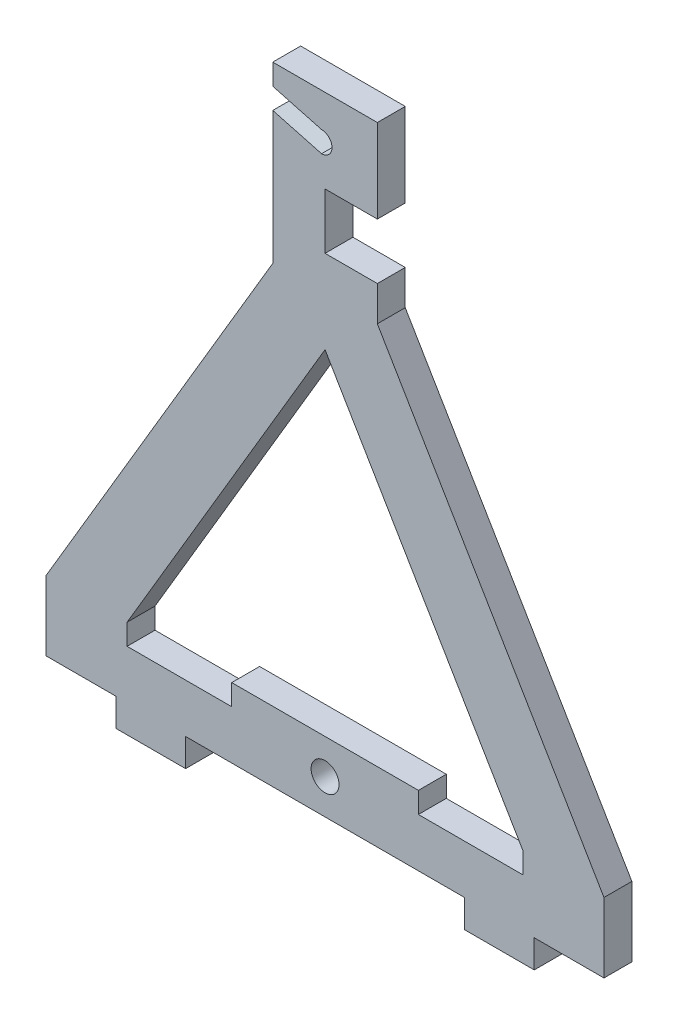
ISO-10303-21;
HEADER;
FILE_DESCRIPTION(('STEP AP214'),'2;1');
FILE_NAME('part.step','',(''),(''),'','','');
FILE_SCHEMA(('AUTOMOTIVE_DESIGN { 1 0 10303 214 1 1 1 1 }'));
ENDSEC;
DATA;
#1=APPLICATION_CONTEXT('core data for automotive mechanical design processes');
#2=APPLICATION_PROTOCOL_DEFINITION('international standard','automotive_design',2000,#1);
#3=PRODUCT_CONTEXT('',#1,'mechanical');
#4=PRODUCT('Part','Part','',(#3));
#5=PRODUCT_RELATED_PRODUCT_CATEGORY('part','',(#4));
#6=PRODUCT_DEFINITION_FORMATION('','',#4);
#7=PRODUCT_DEFINITION_CONTEXT('part definition',#1,'design');
#8=PRODUCT_DEFINITION('design','',#6,#7);
#9=PRODUCT_DEFINITION_SHAPE('','',#8);
#10=(LENGTH_UNIT() NAMED_UNIT(*) SI_UNIT(.MILLI.,.METRE.));
#11=(NAMED_UNIT(*) PLANE_ANGLE_UNIT() SI_UNIT($,.RADIAN.));
#12=(NAMED_UNIT(*) SI_UNIT($,.STERADIAN.) SOLID_ANGLE_UNIT());
#13=UNCERTAINTY_MEASURE_WITH_UNIT(LENGTH_MEASURE(1.E-05),#10,'distance_accuracy_value','');
#14=(GEOMETRIC_REPRESENTATION_CONTEXT(3) GLOBAL_UNCERTAINTY_ASSIGNED_CONTEXT((#13)) GLOBAL_UNIT_ASSIGNED_CONTEXT((#10,
#11,#12)) REPRESENTATION_CONTEXT('',''));
#15=CARTESIAN_POINT('',(0.,0.,0.));
#16=DIRECTION('',(0.,0.,1.));
#17=DIRECTION('',(1.,0.,0.));
#18=AXIS2_PLACEMENT_3D('',#15,#16,#17);
#19=CARTESIAN_POINT('',(-15.,180.,8.));
#20=DIRECTION('',(1.,0.,0.));
#21=DIRECTION('',(0.,1.,0.));
#22=AXIS2_PLACEMENT_3D('',#19,#20,#21);
#23=PLANE('',#22);
#24=DIRECTION('',(0.,-1.,0.));
#25=VECTOR('',#24,1.);
#26=CARTESIAN_POINT('',(-15.,180.,0.));
#27=LINE('',#26,#25);
#28=CARTESIAN_POINT('',(-15.,180.,0.));
#29=VERTEX_POINT('',#28);
#30=CARTESIAN_POINT('',(-15.,174.,0.));
#31=VERTEX_POINT('',#30);
#32=EDGE_CURVE('E470',#29,#31,#27,.T.);
#33=ORIENTED_EDGE('',*,*,#32,.T.);
#34=DIRECTION('',(0.,0.,1.));
#35=VECTOR('',#34,1.);
#36=CARTESIAN_POINT('',(-15.,174.,0.));
#37=LINE('',#36,#35);
#38=CARTESIAN_POINT('',(-15.,174.,8.));
#39=VERTEX_POINT('',#38);
#40=EDGE_CURVE('E279',#31,#39,#37,.T.);
#41=ORIENTED_EDGE('',*,*,#40,.T.);
#42=DIRECTION('',(0.,-1.,0.));
#43=VECTOR('',#42,1.);
#44=CARTESIAN_POINT('',(-15.,180.,8.));
#45=LINE('',#44,#43);
#46=CARTESIAN_POINT('',(-15.,180.,8.));
#47=VERTEX_POINT('',#46);
#48=EDGE_CURVE('E447',#47,#39,#45,.T.);
#49=ORIENTED_EDGE('',*,*,#48,.F.);
#50=DIRECTION('',(0.,0.,-1.));
#51=VECTOR('',#50,1.);
#52=CARTESIAN_POINT('',(-15.,180.,8.));
#53=LINE('',#52,#51);
#54=EDGE_CURVE('E491',#47,#29,#53,.T.);
#55=ORIENTED_EDGE('',*,*,#54,.T.);
#56=EDGE_LOOP('',(#33,#41,#49,#55));
#57=FACE_BOUND('',#56,.T.);
#58=ADVANCED_FACE('F33',(#57),#23,.F.);
#59=CARTESIAN_POINT('',(0.,0.,8.));
#60=DIRECTION('',(0.,0.,1.));
#61=DIRECTION('',(1.,0.,0.));
#62=AXIS2_PLACEMENT_3D('',#59,#60,#61);
#63=PLANE('',#62);
#64=DIRECTION('',(-0.965925826289067,0.258819045102526,0.));
#65=VECTOR('',#64,1.);
#66=CARTESIAN_POINT('',(-15.,174.,8.));
#67=LINE('',#66,#65);
#68=CARTESIAN_POINT('',(-1.,170.248711305964,8.));
#69=VERTEX_POINT('',#68);
#70=EDGE_CURVE('E271',#69,#39,#67,.T.);
#71=ORIENTED_EDGE('',*,*,#70,.F.);
#72=CARTESIAN_POINT('',(-1.,167.248711305964,8.));
#73=DIRECTION('',(0.,0.,1.));
#74=DIRECTION('',(1.,0.,0.));
#75=AXIS2_PLACEMENT_3D('',#72,#73,#74);
#76=CIRCLE('',#75,2.99999999999999);
#77=CARTESIAN_POINT('',(-1.,164.248711305964,8.));
#78=VERTEX_POINT('',#77);
#79=EDGE_CURVE('E273',#78,#69,#76,.T.);
#80=ORIENTED_EDGE('',*,*,#79,.F.);
#81=DIRECTION('',(0.965925826289067,-0.258819045102524,0.));
#82=VECTOR('',#81,1.);
#83=CARTESIAN_POINT('',(-1.,164.248711305964,8.));
#84=LINE('',#83,#82);
#85=CARTESIAN_POINT('',(-15.,168.,8.));
#86=VERTEX_POINT('',#85);
#87=EDGE_CURVE('E251',#86,#78,#84,.T.);
#88=ORIENTED_EDGE('',*,*,#87,.F.);
#89=CARTESIAN_POINT('',(-15.,130.,8.));
#90=VERTEX_POINT('',#89);
#91=EDGE_CURVE('E446',#86,#90,#45,.T.);
#92=ORIENTED_EDGE('',*,*,#91,.T.);
#93=DIRECTION('',(-0.508729312126641,-0.860926528214315,0.));
#94=VECTOR('',#93,1.);
#95=CARTESIAN_POINT('',(-15.,130.,8.));
#96=LINE('',#95,#94);
#97=CARTESIAN_POINT('',(-80.,20.,8.));
#98=VERTEX_POINT('',#97);
#99=EDGE_CURVE('E450',#90,#98,#96,.T.);
#100=ORIENTED_EDGE('',*,*,#99,.T.);
#101=DIRECTION('',(0.,-1.,0.));
#102=VECTOR('',#101,1.);
#103=CARTESIAN_POINT('',(-80.,20.,8.));
#104=LINE('',#103,#102);
#105=CARTESIAN_POINT('',(-80.,0.,8.));
#106=VERTEX_POINT('',#105);
#107=EDGE_CURVE('E452',#98,#106,#104,.T.);
#108=ORIENTED_EDGE('',*,*,#107,.T.);
#109=DIRECTION('',(1.,0.,0.));
#110=VECTOR('',#109,1.);
#111=CARTESIAN_POINT('',(-80.,0.,8.));
#112=LINE('',#111,#110);
#113=CARTESIAN_POINT('',(-60.,0.,8.));
#114=VERTEX_POINT('',#113);
#115=EDGE_CURVE('E455',#106,#114,#112,.T.);
#116=ORIENTED_EDGE('',*,*,#115,.T.);
#117=DIRECTION('',(0.,1.,0.));
#118=VECTOR('',#117,1.);
#119=CARTESIAN_POINT('',(-60.,-8.,8.));
#120=LINE('',#119,#118);
#121=CARTESIAN_POINT('',(-60.,-8.,8.));
#122=VERTEX_POINT('',#121);
#123=EDGE_CURVE('E386',#122,#114,#120,.T.);
#124=ORIENTED_EDGE('',*,*,#123,.F.);
#125=DIRECTION('',(-1.,0.,0.));
#126=VECTOR('',#125,1.);
#127=CARTESIAN_POINT('',(-60.,-8.,8.));
#128=LINE('',#127,#126);
#129=CARTESIAN_POINT('',(-40.,-8.,8.));
#130=VERTEX_POINT('',#129);
#131=EDGE_CURVE('E384',#130,#122,#128,.T.);
#132=ORIENTED_EDGE('',*,*,#131,.F.);
#133=DIRECTION('',(0.,1.,0.));
#134=VECTOR('',#133,1.);
#135=CARTESIAN_POINT('',(-40.,-8.,8.));
#136=LINE('',#135,#134);
#137=CARTESIAN_POINT('',(-40.,0.,8.));
#138=VERTEX_POINT('',#137);
#139=EDGE_CURVE('E393',#130,#138,#136,.T.);
#140=ORIENTED_EDGE('',*,*,#139,.T.);
#141=CARTESIAN_POINT('',(40.,0.,8.));
#142=VERTEX_POINT('',#141);
#143=EDGE_CURVE('E459',#138,#142,#112,.T.);
#144=ORIENTED_EDGE('',*,*,#143,.T.);
#145=DIRECTION('',(0.,1.,0.));
#146=VECTOR('',#145,1.);
#147=CARTESIAN_POINT('',(40.,-8.,8.));
#148=LINE('',#147,#146);
#149=CARTESIAN_POINT('',(40.,-8.,8.));
#150=VERTEX_POINT('',#149);
#151=EDGE_CURVE('E369',#150,#142,#148,.T.);
#152=ORIENTED_EDGE('',*,*,#151,.F.);
#153=DIRECTION('',(1.,0.,0.));
#154=VECTOR('',#153,1.);
#155=CARTESIAN_POINT('',(60.,-8.,8.));
#156=LINE('',#155,#154);
#157=CARTESIAN_POINT('',(60.,-8.,8.));
#158=VERTEX_POINT('',#157);
#159=EDGE_CURVE('E350',#150,#158,#156,.T.);
#160=ORIENTED_EDGE('',*,*,#159,.T.);
#161=DIRECTION('',(0.,1.,0.));
#162=VECTOR('',#161,1.);
#163=CARTESIAN_POINT('',(60.,-8.,8.));
#164=LINE('',#163,#162);
#165=CARTESIAN_POINT('',(60.,0.,8.));
#166=VERTEX_POINT('',#165);
#167=EDGE_CURVE('E372',#158,#166,#164,.T.);
#168=ORIENTED_EDGE('',*,*,#167,.T.);
#169=CARTESIAN_POINT('',(80.,0.,8.));
#170=VERTEX_POINT('',#169);
#171=EDGE_CURVE('E454',#166,#170,#112,.T.);
#172=ORIENTED_EDGE('',*,*,#171,.T.);
#173=DIRECTION('',(0.,1.,0.));
#174=VECTOR('',#173,1.);
#175=CARTESIAN_POINT('',(80.,0.,8.));
#176=LINE('',#175,#174);
#177=CARTESIAN_POINT('',(80.,20.,8.));
#178=VERTEX_POINT('',#177);
#179=EDGE_CURVE('E434',#170,#178,#176,.T.);
#180=ORIENTED_EDGE('',*,*,#179,.T.);
#181=DIRECTION('',(-0.508729312126641,0.860926528214315,0.));
#182=VECTOR('',#181,1.);
#183=CARTESIAN_POINT('',(80.,20.,8.));
#184=LINE('',#183,#182);
#185=CARTESIAN_POINT('',(15.,130.,8.));
#186=VERTEX_POINT('',#185);
#187=EDGE_CURVE('E437',#178,#186,#184,.T.);
#188=ORIENTED_EDGE('',*,*,#187,.T.);
#189=DIRECTION('',(0.,1.,0.));
#190=VECTOR('',#189,1.);
#191=CARTESIAN_POINT('',(15.,180.,8.));
#192=LINE('',#191,#190);
#193=CARTESIAN_POINT('',(15.,140.,8.));
#194=VERTEX_POINT('',#193);
#195=EDGE_CURVE('E441',#186,#194,#192,.T.);
#196=ORIENTED_EDGE('',*,*,#195,.T.);
#197=DIRECTION('',(1.,0.,0.));
#198=VECTOR('',#197,1.);
#199=CARTESIAN_POINT('',(15.,140.,8.));
#200=LINE('',#199,#198);
#201=CARTESIAN_POINT('',(0.,140.,8.));
#202=VERTEX_POINT('',#201);
#203=EDGE_CURVE('E336',#202,#194,#200,.T.);
#204=ORIENTED_EDGE('',*,*,#203,.F.);
#205=DIRECTION('',(0.,-1.,0.));
#206=VECTOR('',#205,1.);
#207=CARTESIAN_POINT('',(0.,156.,8.));
#208=LINE('',#207,#206);
#209=CARTESIAN_POINT('',(0.,156.,8.));
#210=VERTEX_POINT('',#209);
#211=EDGE_CURVE('E333',#210,#202,#208,.T.);
#212=ORIENTED_EDGE('',*,*,#211,.F.);
#213=DIRECTION('',(-1.,0.,0.));
#214=VECTOR('',#213,1.);
#215=CARTESIAN_POINT('',(15.,156.,8.));
#216=LINE('',#215,#214);
#217=CARTESIAN_POINT('',(15.,156.,8.));
#218=VERTEX_POINT('',#217);
#219=EDGE_CURVE('E327',#218,#210,#216,.T.);
#220=ORIENTED_EDGE('',*,*,#219,.F.);
#221=CARTESIAN_POINT('',(15.,180.,8.));
#222=VERTEX_POINT('',#221);
#223=EDGE_CURVE('E440',#218,#222,#192,.T.);
#224=ORIENTED_EDGE('',*,*,#223,.T.);
#225=DIRECTION('',(-1.,0.,0.));
#226=VECTOR('',#225,1.);
#227=CARTESIAN_POINT('',(15.,180.,8.));
#228=LINE('',#227,#226);
#229=EDGE_CURVE('E444',#222,#47,#228,.T.);
#230=ORIENTED_EDGE('',*,*,#229,.T.);
#231=ORIENTED_EDGE('',*,*,#48,.T.);
#232=EDGE_LOOP('',(#71,#80,#88,#92,#100,#108,#116,#124,#132,#140,#144,#152,#160,#168,#172,#180,
#188,#196,#204,#212,#220,#224,#230,#231));
#233=FACE_BOUND('',#232,.T.);
#234=CARTESIAN_POINT('',(0.,9.99999999999999,8.));
#235=DIRECTION('',(0.,0.,1.));
#236=DIRECTION('',(1.,0.,0.));
#237=AXIS2_PLACEMENT_3D('',#234,#235,#236);
#238=CIRCLE('',#237,4.);
#239=CARTESIAN_POINT('',(4.,9.99999999999999,8.));
#240=VERTEX_POINT('',#239);
#241=EDGE_CURVE('E403',#240,#240,#238,.T.);
#242=ORIENTED_EDGE('',*,*,#241,.F.);
#243=EDGE_LOOP('',(#242));
#244=FACE_BOUND('',#243,.T.);
#245=DIRECTION('',(-0.508729312126641,0.860926528214315,0.));
#246=VECTOR('',#245,1.);
#247=CARTESIAN_POINT('',(0.,116.070977417906,8.));
#248=LINE('',#247,#246);
#249=CARTESIAN_POINT('',(56.7692139287625,20.,8.));
#250=VERTEX_POINT('',#249);
#251=CARTESIAN_POINT('',(0.,116.070977417906,8.));
#252=VERTEX_POINT('',#251);
#253=EDGE_CURVE('E412',#250,#252,#248,.T.);
#254=ORIENTED_EDGE('',*,*,#253,.F.);
#255=DIRECTION('',(0.,-1.,0.));
#256=VECTOR('',#255,1.);
#257=CARTESIAN_POINT('',(56.7692139287625,20.,8.));
#258=LINE('',#257,#256);
#259=CARTESIAN_POINT('',(56.7692139287625,14.,8.));
#260=VERTEX_POINT('',#259);
#261=EDGE_CURVE('E282',#250,#260,#258,.T.);
#262=ORIENTED_EDGE('',*,*,#261,.T.);
#263=DIRECTION('',(-1.,0.,0.));
#264=VECTOR('',#263,1.);
#265=CARTESIAN_POINT('',(56.7692139287625,14.,8.));
#266=LINE('',#265,#264);
#267=CARTESIAN_POINT('',(26.7692139287625,14.,8.));
#268=VERTEX_POINT('',#267);
#269=EDGE_CURVE('E288',#260,#268,#266,.T.);
#270=ORIENTED_EDGE('',*,*,#269,.T.);
#271=DIRECTION('',(0.,1.,0.));
#272=VECTOR('',#271,1.);
#273=CARTESIAN_POINT('',(26.7692139287625,20.,8.));
#274=LINE('',#273,#272);
#275=CARTESIAN_POINT('',(26.7692139287625,20.,8.));
#276=VERTEX_POINT('',#275);
#277=EDGE_CURVE('E295',#268,#276,#274,.T.);
#278=ORIENTED_EDGE('',*,*,#277,.T.);
#279=DIRECTION('',(1.,0.,0.));
#280=VECTOR('',#279,1.);
#281=CARTESIAN_POINT('',(56.7692139287625,20.,8.));
#282=LINE('',#281,#280);
#283=CARTESIAN_POINT('',(-26.7692139287625,20.,8.));
#284=VERTEX_POINT('',#283);
#285=EDGE_CURVE('E409',#284,#276,#282,.T.);
#286=ORIENTED_EDGE('',*,*,#285,.F.);
#287=DIRECTION('',(0.,1.,0.));
#288=VECTOR('',#287,1.);
#289=CARTESIAN_POINT('',(-26.7692139287625,20.,8.));
#290=LINE('',#289,#288);
#291=CARTESIAN_POINT('',(-26.7692139287625,14.,8.));
#292=VERTEX_POINT('',#291);
#293=EDGE_CURVE('E311',#292,#284,#290,.T.);
#294=ORIENTED_EDGE('',*,*,#293,.F.);
#295=DIRECTION('',(1.,0.,0.));
#296=VECTOR('',#295,1.);
#297=CARTESIAN_POINT('',(-56.7692139287625,14.,8.));
#298=LINE('',#297,#296);
#299=CARTESIAN_POINT('',(-56.7692139287625,14.,8.));
#300=VERTEX_POINT('',#299);
#301=EDGE_CURVE('E320',#300,#292,#298,.T.);
#302=ORIENTED_EDGE('',*,*,#301,.F.);
#303=DIRECTION('',(0.,-1.,0.));
#304=VECTOR('',#303,1.);
#305=CARTESIAN_POINT('',(-56.7692139287625,20.,8.));
#306=LINE('',#305,#304);
#307=CARTESIAN_POINT('',(-56.7692139287625,20.,8.));
#308=VERTEX_POINT('',#307);
#309=EDGE_CURVE('E303',#308,#300,#306,.T.);
#310=ORIENTED_EDGE('',*,*,#309,.F.);
#311=DIRECTION('',(-0.508729312126641,-0.860926528214315,0.));
#312=VECTOR('',#311,1.);
#313=CARTESIAN_POINT('',(-56.7692139287625,20.,8.));
#314=LINE('',#313,#312);
#315=EDGE_CURVE('E416',#252,#308,#314,.T.);
#316=ORIENTED_EDGE('',*,*,#315,.F.);
#317=EDGE_LOOP('',(#254,#262,#270,#278,#286,#294,#302,#310,#316));
#318=FACE_BOUND('',#317,.T.);
#319=ADVANCED_FACE('F513',(#233,#244,#318),#63,.T.);
#320=CARTESIAN_POINT('',(0.,0.,0.));
#321=DIRECTION('',(0.,0.,1.));
#322=DIRECTION('',(1.,0.,0.));
#323=AXIS2_PLACEMENT_3D('',#320,#321,#322);
#324=PLANE('',#323);
#325=CARTESIAN_POINT('',(0.,9.99999999999999,0.));
#326=DIRECTION('',(0.,0.,1.));
#327=DIRECTION('',(1.,0.,0.));
#328=AXIS2_PLACEMENT_3D('',#325,#326,#327);
#329=CIRCLE('',#328,4.);
#330=CARTESIAN_POINT('',(4.,9.99999999999999,0.));
#331=VERTEX_POINT('',#330);
#332=EDGE_CURVE('E402',#331,#331,#329,.T.);
#333=ORIENTED_EDGE('',*,*,#332,.T.);
#334=EDGE_LOOP('',(#333));
#335=FACE_BOUND('',#334,.T.);
#336=CARTESIAN_POINT('',(-1.,167.248711305964,0.));
#337=DIRECTION('',(0.,0.,1.));
#338=DIRECTION('',(1.,0.,0.));
#339=AXIS2_PLACEMENT_3D('',#336,#337,#338);
#340=CIRCLE('',#339,2.99999999999999);
#341=CARTESIAN_POINT('',(-1.,164.248711305964,0.));
#342=VERTEX_POINT('',#341);
#343=CARTESIAN_POINT('',(-1.,170.248711305964,0.));
#344=VERTEX_POINT('',#343);
#345=EDGE_CURVE('E259',#342,#344,#340,.T.);
#346=ORIENTED_EDGE('',*,*,#345,.T.);
#347=DIRECTION('',(-0.965925826289067,0.258819045102526,0.));
#348=VECTOR('',#347,1.);
#349=CARTESIAN_POINT('',(-15.,174.,0.));
#350=LINE('',#349,#348);
#351=EDGE_CURVE('E264',#344,#31,#350,.T.);
#352=ORIENTED_EDGE('',*,*,#351,.T.);
#353=ORIENTED_EDGE('',*,*,#32,.F.);
#354=DIRECTION('',(-1.,0.,0.));
#355=VECTOR('',#354,1.);
#356=CARTESIAN_POINT('',(15.,180.,0.));
#357=LINE('',#356,#355);
#358=CARTESIAN_POINT('',(15.,180.,0.));
#359=VERTEX_POINT('',#358);
#360=EDGE_CURVE('E468',#359,#29,#357,.T.);
#361=ORIENTED_EDGE('',*,*,#360,.F.);
#362=DIRECTION('',(0.,1.,0.));
#363=VECTOR('',#362,1.);
#364=CARTESIAN_POINT('',(15.,180.,0.));
#365=LINE('',#364,#363);
#366=CARTESIAN_POINT('',(15.,156.,0.));
#367=VERTEX_POINT('',#366);
#368=EDGE_CURVE('E464',#367,#359,#365,.T.);
#369=ORIENTED_EDGE('',*,*,#368,.F.);
#370=DIRECTION('',(-1.,0.,0.));
#371=VECTOR('',#370,1.);
#372=CARTESIAN_POINT('',(0.,156.,0.));
#373=LINE('',#372,#371);
#374=CARTESIAN_POINT('',(0.,156.,0.));
#375=VERTEX_POINT('',#374);
#376=EDGE_CURVE('E56',#367,#375,#373,.T.);
#377=ORIENTED_EDGE('',*,*,#376,.T.);
#378=DIRECTION('',(0.,-1.,0.));
#379=VECTOR('',#378,1.);
#380=CARTESIAN_POINT('',(0.,0.,0.));
#381=LINE('',#380,#379);
#382=CARTESIAN_POINT('',(0.,140.,0.));
#383=VERTEX_POINT('',#382);
#384=EDGE_CURVE('E11',#375,#383,#381,.T.);
#385=ORIENTED_EDGE('',*,*,#384,.T.);
#386=DIRECTION('',(1.,0.,0.));
#387=VECTOR('',#386,1.);
#388=CARTESIAN_POINT('',(0.,140.,0.));
#389=LINE('',#388,#387);
#390=CARTESIAN_POINT('',(15.,140.,0.));
#391=VERTEX_POINT('',#390);
#392=EDGE_CURVE('E343',#383,#391,#389,.T.);
#393=ORIENTED_EDGE('',*,*,#392,.T.);
#394=CARTESIAN_POINT('',(15.,130.,0.));
#395=VERTEX_POINT('',#394);
#396=EDGE_CURVE('E465',#395,#391,#365,.T.);
#397=ORIENTED_EDGE('',*,*,#396,.F.);
#398=DIRECTION('',(-0.508729312126641,0.860926528214315,0.));
#399=VECTOR('',#398,1.);
#400=CARTESIAN_POINT('',(80.,20.,0.));
#401=LINE('',#400,#399);
#402=CARTESIAN_POINT('',(80.,20.,0.));
#403=VERTEX_POINT('',#402);
#404=EDGE_CURVE('E462',#403,#395,#401,.T.);
#405=ORIENTED_EDGE('',*,*,#404,.F.);
#406=DIRECTION('',(0.,1.,0.));
#407=VECTOR('',#406,1.);
#408=CARTESIAN_POINT('',(80.,0.,0.));
#409=LINE('',#408,#407);
#410=CARTESIAN_POINT('',(80.,0.,0.));
#411=VERTEX_POINT('',#410);
#412=EDGE_CURVE('E433',#411,#403,#409,.T.);
#413=ORIENTED_EDGE('',*,*,#412,.F.);
#414=DIRECTION('',(1.,0.,0.));
#415=VECTOR('',#414,1.);
#416=CARTESIAN_POINT('',(-80.,0.,0.));
#417=LINE('',#416,#415);
#418=CARTESIAN_POINT('',(60.,0.,0.));
#419=VERTEX_POINT('',#418);
#420=EDGE_CURVE('E477',#419,#411,#417,.T.);
#421=ORIENTED_EDGE('',*,*,#420,.F.);
#422=DIRECTION('',(0.,1.,0.));
#423=VECTOR('',#422,1.);
#424=CARTESIAN_POINT('',(60.,-8.,0.));
#425=LINE('',#424,#423);
#426=CARTESIAN_POINT('',(60.,-8.,0.));
#427=VERTEX_POINT('',#426);
#428=EDGE_CURVE('E360',#427,#419,#425,.T.);
#429=ORIENTED_EDGE('',*,*,#428,.F.);
#430=DIRECTION('',(-1.,0.,0.));
#431=VECTOR('',#430,1.);
#432=CARTESIAN_POINT('',(60.,-8.,0.));
#433=LINE('',#432,#431);
#434=CARTESIAN_POINT('',(40.,-8.,0.));
#435=VERTEX_POINT('',#434);
#436=EDGE_CURVE('E357',#427,#435,#433,.T.);
#437=ORIENTED_EDGE('',*,*,#436,.T.);
#438=DIRECTION('',(0.,1.,0.));
#439=VECTOR('',#438,1.);
#440=CARTESIAN_POINT('',(40.,-8.,0.));
#441=LINE('',#440,#439);
#442=CARTESIAN_POINT('',(40.,0.,0.));
#443=VERTEX_POINT('',#442);
#444=EDGE_CURVE('E366',#435,#443,#441,.T.);
#445=ORIENTED_EDGE('',*,*,#444,.T.);
#446=CARTESIAN_POINT('',(-40.,0.,0.));
#447=VERTEX_POINT('',#446);
#448=EDGE_CURVE('E479',#447,#443,#417,.T.);
#449=ORIENTED_EDGE('',*,*,#448,.F.);
#450=DIRECTION('',(0.,1.,0.));
#451=VECTOR('',#450,1.);
#452=CARTESIAN_POINT('',(-40.,-8.,0.));
#453=LINE('',#452,#451);
#454=CARTESIAN_POINT('',(-40.,-8.,0.));
#455=VERTEX_POINT('',#454);
#456=EDGE_CURVE('E396',#455,#447,#453,.T.);
#457=ORIENTED_EDGE('',*,*,#456,.F.);
#458=DIRECTION('',(1.,0.,0.));
#459=VECTOR('',#458,1.);
#460=CARTESIAN_POINT('',(-60.,-8.,0.));
#461=LINE('',#460,#459);
#462=CARTESIAN_POINT('',(-60.,-8.,0.));
#463=VERTEX_POINT('',#462);
#464=EDGE_CURVE('E379',#463,#455,#461,.T.);
#465=ORIENTED_EDGE('',*,*,#464,.F.);
#466=DIRECTION('',(0.,1.,0.));
#467=VECTOR('',#466,1.);
#468=CARTESIAN_POINT('',(-60.,-8.,0.));
#469=LINE('',#468,#467);
#470=CARTESIAN_POINT('',(-60.,0.,0.));
#471=VERTEX_POINT('',#470);
#472=EDGE_CURVE('E399',#463,#471,#469,.T.);
#473=ORIENTED_EDGE('',*,*,#472,.T.);
#474=CARTESIAN_POINT('',(-80.,0.,0.));
#475=VERTEX_POINT('',#474);
#476=EDGE_CURVE('E438',#475,#471,#417,.T.);
#477=ORIENTED_EDGE('',*,*,#476,.F.);
#478=DIRECTION('',(0.,-1.,0.));
#479=VECTOR('',#478,1.);
#480=CARTESIAN_POINT('',(-80.,20.,0.));
#481=LINE('',#480,#479);
#482=CARTESIAN_POINT('',(-80.,20.,0.));
#483=VERTEX_POINT('',#482);
#484=EDGE_CURVE('E475',#483,#475,#481,.T.);
#485=ORIENTED_EDGE('',*,*,#484,.F.);
#486=DIRECTION('',(-0.508729312126641,-0.860926528214315,0.));
#487=VECTOR('',#486,1.);
#488=CARTESIAN_POINT('',(-15.,130.,0.));
#489=LINE('',#488,#487);
#490=CARTESIAN_POINT('',(-15.,130.,0.));
#491=VERTEX_POINT('',#490);
#492=EDGE_CURVE('E473',#491,#483,#489,.T.);
#493=ORIENTED_EDGE('',*,*,#492,.F.);
#494=CARTESIAN_POINT('',(-15.,168.,0.));
#495=VERTEX_POINT('',#494);
#496=EDGE_CURVE('E270',#495,#491,#27,.T.);
#497=ORIENTED_EDGE('',*,*,#496,.F.);
#498=DIRECTION('',(0.965925826289067,-0.258819045102524,0.));
#499=VECTOR('',#498,1.);
#500=CARTESIAN_POINT('',(-1.,164.248711305964,0.));
#501=LINE('',#500,#499);
#502=EDGE_CURVE('E48',#495,#342,#501,.T.);
#503=ORIENTED_EDGE('',*,*,#502,.T.);
#504=EDGE_LOOP('',(#346,#352,#353,#361,#369,#377,#385,#393,#397,#405,#413,#421,#429,#437,#445,
#449,#457,#465,#473,#477,#485,#493,#497,#503));
#505=FACE_BOUND('',#504,.T.);
#506=DIRECTION('',(0.,-1.,0.));
#507=VECTOR('',#506,1.);
#508=CARTESIAN_POINT('',(56.7692139287625,20.,0.));
#509=LINE('',#508,#507);
#510=CARTESIAN_POINT('',(56.7692139287625,20.,0.));
#511=VERTEX_POINT('',#510);
#512=CARTESIAN_POINT('',(56.7692139287625,14.,0.));
#513=VERTEX_POINT('',#512);
#514=EDGE_CURVE('E285',#511,#513,#509,.T.);
#515=ORIENTED_EDGE('',*,*,#514,.F.);
#516=DIRECTION('',(-0.508729312126641,0.860926528214315,0.));
#517=VECTOR('',#516,1.);
#518=CARTESIAN_POINT('',(0.,116.070977417906,0.));
#519=LINE('',#518,#517);
#520=CARTESIAN_POINT('',(0.,116.070977417906,0.));
#521=VERTEX_POINT('',#520);
#522=EDGE_CURVE('E422',#511,#521,#519,.T.);
#523=ORIENTED_EDGE('',*,*,#522,.T.);
#524=DIRECTION('',(-0.508729312126641,-0.860926528214315,0.));
#525=VECTOR('',#524,1.);
#526=CARTESIAN_POINT('',(-56.7692139287625,20.,0.));
#527=LINE('',#526,#525);
#528=CARTESIAN_POINT('',(-56.7692139287625,20.,0.));
#529=VERTEX_POINT('',#528);
#530=EDGE_CURVE('E413',#521,#529,#527,.T.);
#531=ORIENTED_EDGE('',*,*,#530,.T.);
#532=DIRECTION('',(0.,-1.,0.));
#533=VECTOR('',#532,1.);
#534=CARTESIAN_POINT('',(-56.7692139287625,20.,0.));
#535=LINE('',#534,#533);
#536=CARTESIAN_POINT('',(-56.7692139287625,14.,0.));
#537=VERTEX_POINT('',#536);
#538=EDGE_CURVE('E307',#529,#537,#535,.T.);
#539=ORIENTED_EDGE('',*,*,#538,.T.);
#540=DIRECTION('',(1.,0.,0.));
#541=VECTOR('',#540,1.);
#542=CARTESIAN_POINT('',(-56.7692139287625,14.,0.));
#543=LINE('',#542,#541);
#544=CARTESIAN_POINT('',(-26.7692139287625,14.,0.));
#545=VERTEX_POINT('',#544);
#546=EDGE_CURVE('E310',#537,#545,#543,.T.);
#547=ORIENTED_EDGE('',*,*,#546,.T.);
#548=DIRECTION('',(0.,1.,0.));
#549=VECTOR('',#548,1.);
#550=CARTESIAN_POINT('',(-26.7692139287625,20.,0.));
#551=LINE('',#550,#549);
#552=CARTESIAN_POINT('',(-26.7692139287625,20.,0.));
#553=VERTEX_POINT('',#552);
#554=EDGE_CURVE('E314',#545,#553,#551,.T.);
#555=ORIENTED_EDGE('',*,*,#554,.T.);
#556=DIRECTION('',(1.,0.,0.));
#557=VECTOR('',#556,1.);
#558=CARTESIAN_POINT('',(56.7692139287625,20.,0.));
#559=LINE('',#558,#557);
#560=CARTESIAN_POINT('',(26.7692139287625,20.,0.));
#561=VERTEX_POINT('',#560);
#562=EDGE_CURVE('E406',#553,#561,#559,.T.);
#563=ORIENTED_EDGE('',*,*,#562,.T.);
#564=DIRECTION('',(0.,1.,0.));
#565=VECTOR('',#564,1.);
#566=CARTESIAN_POINT('',(26.7692139287625,20.,0.));
#567=LINE('',#566,#565);
#568=CARTESIAN_POINT('',(26.7692139287625,14.,0.));
#569=VERTEX_POINT('',#568);
#570=EDGE_CURVE('E287',#569,#561,#567,.T.);
#571=ORIENTED_EDGE('',*,*,#570,.F.);
#572=DIRECTION('',(-1.,0.,0.));
#573=VECTOR('',#572,1.);
#574=CARTESIAN_POINT('',(56.7692139287625,14.,0.));
#575=LINE('',#574,#573);
#576=EDGE_CURVE('E290',#513,#569,#575,.T.);
#577=ORIENTED_EDGE('',*,*,#576,.F.);
#578=EDGE_LOOP('',(#515,#523,#531,#539,#547,#555,#563,#571,#577));
#579=FACE_BOUND('',#578,.T.);
#580=ADVANCED_FACE('F267',(#335,#505,#579),#324,.F.);
#581=CARTESIAN_POINT('',(56.7692139287625,20.,8.));
#582=DIRECTION('',(0.,1.,0.));
#583=DIRECTION('',(0.,0.,1.));
#584=AXIS2_PLACEMENT_3D('',#581,#582,#583);
#585=PLANE('',#584);
#586=ORIENTED_EDGE('',*,*,#285,.T.);
#587=DIRECTION('',(0.,0.,1.));
#588=VECTOR('',#587,1.);
#589=CARTESIAN_POINT('',(26.7692139287625,20.,0.));
#590=LINE('',#589,#588);
#591=EDGE_CURVE('E292',#561,#276,#590,.T.);
#592=ORIENTED_EDGE('',*,*,#591,.F.);
#593=ORIENTED_EDGE('',*,*,#562,.F.);
#594=DIRECTION('',(0.,0.,1.));
#595=VECTOR('',#594,1.);
#596=CARTESIAN_POINT('',(-26.7692139287625,20.,0.));
#597=LINE('',#596,#595);
#598=EDGE_CURVE('E324',#553,#284,#597,.T.);
#599=ORIENTED_EDGE('',*,*,#598,.T.);
#600=EDGE_LOOP('',(#586,#592,#593,#599));
#601=FACE_BOUND('',#600,.T.);
#602=ADVANCED_FACE('F608',(#601),#585,.T.);
#603=CARTESIAN_POINT('',(15.,180.,8.));
#604=DIRECTION('',(-1.,0.,0.));
#605=DIRECTION('',(0.,-1.,0.));
#606=AXIS2_PLACEMENT_3D('',#603,#604,#605);
#607=PLANE('',#606);
#608=ORIENTED_EDGE('',*,*,#396,.T.);
#609=DIRECTION('',(0.,0.,1.));
#610=VECTOR('',#609,1.);
#611=CARTESIAN_POINT('',(15.,140.,8.));
#612=LINE('',#611,#610);
#613=EDGE_CURVE('E41',#391,#194,#612,.T.);
#614=ORIENTED_EDGE('',*,*,#613,.T.);
#615=ORIENTED_EDGE('',*,*,#195,.F.);
#616=DIRECTION('',(0.,0.,-1.));
#617=VECTOR('',#616,1.);
#618=CARTESIAN_POINT('',(15.,130.,8.));
#619=LINE('',#618,#617);
#620=EDGE_CURVE('E497',#186,#395,#619,.T.);
#621=ORIENTED_EDGE('',*,*,#620,.T.);
#622=EDGE_LOOP('',(#608,#614,#615,#621));
#623=FACE_BOUND('',#622,.T.);
#624=ADVANCED_FACE('F507',(#623),#607,.F.);
#625=CARTESIAN_POINT('',(-80.,0.,8.));
#626=DIRECTION('',(0.,1.,0.));
#627=DIRECTION('',(0.,0.,1.));
#628=AXIS2_PLACEMENT_3D('',#625,#626,#627);
#629=PLANE('',#628);
#630=ORIENTED_EDGE('',*,*,#171,.F.);
#631=DIRECTION('',(0.,0.,-1.));
#632=VECTOR('',#631,1.);
#633=CARTESIAN_POINT('',(60.,0.,8.));
#634=LINE('',#633,#632);
#635=EDGE_CURVE('E346',#166,#419,#634,.T.);
#636=ORIENTED_EDGE('',*,*,#635,.T.);
#637=ORIENTED_EDGE('',*,*,#420,.T.);
#638=DIRECTION('',(0.,0.,-1.));
#639=VECTOR('',#638,1.);
#640=CARTESIAN_POINT('',(80.,0.,8.));
#641=LINE('',#640,#639);
#642=EDGE_CURVE('E458',#170,#411,#641,.T.);
#643=ORIENTED_EDGE('',*,*,#642,.F.);
#644=EDGE_LOOP('',(#630,#636,#637,#643));
#645=FACE_BOUND('',#644,.T.);
#646=ADVANCED_FACE('F579',(#645),#629,.F.);
#647=DIRECTION('',(0.,0.,-1.));
#648=VECTOR('',#647,1.);
#649=CARTESIAN_POINT('',(-60.,0.,8.));
#650=LINE('',#649,#648);
#651=EDGE_CURVE('E375',#114,#471,#650,.T.);
#652=ORIENTED_EDGE('',*,*,#651,.F.);
#653=ORIENTED_EDGE('',*,*,#115,.F.);
#654=DIRECTION('',(0.,0.,-1.));
#655=VECTOR('',#654,1.);
#656=CARTESIAN_POINT('',(-80.,0.,8.));
#657=LINE('',#656,#655);
#658=EDGE_CURVE('E482',#106,#475,#657,.T.);
#659=ORIENTED_EDGE('',*,*,#658,.T.);
#660=ORIENTED_EDGE('',*,*,#476,.T.);
#661=EDGE_LOOP('',(#652,#653,#659,#660));
#662=FACE_BOUND('',#661,.T.);
#663=ADVANCED_FACE('F559',(#662),#629,.F.);
#664=ORIENTED_EDGE('',*,*,#448,.T.);
#665=DIRECTION('',(0.,0.,1.));
#666=VECTOR('',#665,1.);
#667=CARTESIAN_POINT('',(40.,0.,8.));
#668=LINE('',#667,#666);
#669=EDGE_CURVE('E351',#443,#142,#668,.T.);
#670=ORIENTED_EDGE('',*,*,#669,.T.);
#671=ORIENTED_EDGE('',*,*,#143,.F.);
#672=DIRECTION('',(0.,0.,1.));
#673=VECTOR('',#672,1.);
#674=CARTESIAN_POINT('',(-40.,0.,8.));
#675=LINE('',#674,#673);
#676=EDGE_CURVE('E380',#447,#138,#675,.T.);
#677=ORIENTED_EDGE('',*,*,#676,.F.);
#678=EDGE_LOOP('',(#664,#670,#671,#677));
#679=FACE_BOUND('',#678,.T.);
#680=ADVANCED_FACE('F575',(#679),#629,.F.);
#681=CARTESIAN_POINT('',(80.,0.,8.));
#682=DIRECTION('',(-1.,0.,0.));
#683=DIRECTION('',(0.,0.,1.));
#684=AXIS2_PLACEMENT_3D('',#681,#682,#683);
#685=PLANE('',#684);
#686=ORIENTED_EDGE('',*,*,#412,.T.);
#687=DIRECTION('',(0.,0.,-1.));
#688=VECTOR('',#687,1.);
#689=CARTESIAN_POINT('',(80.,20.,8.));
#690=LINE('',#689,#688);
#691=EDGE_CURVE('E500',#178,#403,#690,.T.);
#692=ORIENTED_EDGE('',*,*,#691,.F.);
#693=ORIENTED_EDGE('',*,*,#179,.F.);
#694=ORIENTED_EDGE('',*,*,#642,.T.);
#695=EDGE_LOOP('',(#686,#692,#693,#694));
#696=FACE_BOUND('',#695,.T.);
#697=ADVANCED_FACE('F35',(#696),#685,.F.);
#698=CARTESIAN_POINT('',(80.,20.,8.));
#699=DIRECTION('',(-0.860926528214315,-0.508729312126641,0.));
#700=DIRECTION('',(0.508729312126641,-0.860926528214315,0.));
#701=AXIS2_PLACEMENT_3D('',#698,#699,#700);
#702=PLANE('',#701);
#703=ORIENTED_EDGE('',*,*,#404,.T.);
#704=ORIENTED_EDGE('',*,*,#620,.F.);
#705=ORIENTED_EDGE('',*,*,#187,.F.);
#706=ORIENTED_EDGE('',*,*,#691,.T.);
#707=EDGE_LOOP('',(#703,#704,#705,#706));
#708=FACE_BOUND('',#707,.T.);
#709=ADVANCED_FACE('F520',(#708),#702,.F.);
#710=ORIENTED_EDGE('',*,*,#223,.F.);
#711=DIRECTION('',(0.,0.,-1.));
#712=VECTOR('',#711,1.);
#713=CARTESIAN_POINT('',(15.,156.,8.));
#714=LINE('',#713,#712);
#715=EDGE_CURVE('E503',#218,#367,#714,.T.);
#716=ORIENTED_EDGE('',*,*,#715,.T.);
#717=ORIENTED_EDGE('',*,*,#368,.T.);
#718=DIRECTION('',(0.,0.,-1.));
#719=VECTOR('',#718,1.);
#720=CARTESIAN_POINT('',(15.,180.,8.));
#721=LINE('',#720,#719);
#722=EDGE_CURVE('E494',#222,#359,#721,.T.);
#723=ORIENTED_EDGE('',*,*,#722,.F.);
#724=EDGE_LOOP('',(#710,#716,#717,#723));
#725=FACE_BOUND('',#724,.T.);
#726=ADVANCED_FACE('F530',(#725),#607,.F.);
#727=CARTESIAN_POINT('',(15.,180.,8.));
#728=DIRECTION('',(0.,-1.,0.));
#729=DIRECTION('',(0.,0.,-1.));
#730=AXIS2_PLACEMENT_3D('',#727,#728,#729);
#731=PLANE('',#730);
#732=ORIENTED_EDGE('',*,*,#360,.T.);
#733=ORIENTED_EDGE('',*,*,#54,.F.);
#734=ORIENTED_EDGE('',*,*,#229,.F.);
#735=ORIENTED_EDGE('',*,*,#722,.T.);
#736=EDGE_LOOP('',(#732,#733,#734,#735));
#737=FACE_BOUND('',#736,.T.);
#738=ADVANCED_FACE('F536',(#737),#731,.F.);
#739=ORIENTED_EDGE('',*,*,#91,.F.);
#740=DIRECTION('',(0.,0.,1.));
#741=VECTOR('',#740,1.);
#742=CARTESIAN_POINT('',(-15.,168.,0.));
#743=LINE('',#742,#741);
#744=EDGE_CURVE('E256',#495,#86,#743,.T.);
#745=ORIENTED_EDGE('',*,*,#744,.F.);
#746=ORIENTED_EDGE('',*,*,#496,.T.);
#747=DIRECTION('',(0.,0.,-1.));
#748=VECTOR('',#747,1.);
#749=CARTESIAN_POINT('',(-15.,130.,8.));
#750=LINE('',#749,#748);
#751=EDGE_CURVE('E488',#90,#491,#750,.T.);
#752=ORIENTED_EDGE('',*,*,#751,.F.);
#753=EDGE_LOOP('',(#739,#745,#746,#752));
#754=FACE_BOUND('',#753,.T.);
#755=ADVANCED_FACE('F545',(#754),#23,.F.);
#756=CARTESIAN_POINT('',(-15.,130.,8.));
#757=DIRECTION('',(0.860926528214315,-0.508729312126641,0.));
#758=DIRECTION('',(0.508729312126641,0.860926528214315,0.));
#759=AXIS2_PLACEMENT_3D('',#756,#757,#758);
#760=PLANE('',#759);
#761=ORIENTED_EDGE('',*,*,#492,.T.);
#762=DIRECTION('',(0.,0.,-1.));
#763=VECTOR('',#762,1.);
#764=CARTESIAN_POINT('',(-80.,20.,8.));
#765=LINE('',#764,#763);
#766=EDGE_CURVE('E485',#98,#483,#765,.T.);
#767=ORIENTED_EDGE('',*,*,#766,.F.);
#768=ORIENTED_EDGE('',*,*,#99,.F.);
#769=ORIENTED_EDGE('',*,*,#751,.T.);
#770=EDGE_LOOP('',(#761,#767,#768,#769));
#771=FACE_BOUND('',#770,.T.);
#772=ADVANCED_FACE('F549',(#771),#760,.F.);
#773=CARTESIAN_POINT('',(-80.,20.,8.));
#774=DIRECTION('',(1.,0.,0.));
#775=DIRECTION('',(0.,0.,-1.));
#776=AXIS2_PLACEMENT_3D('',#773,#774,#775);
#777=PLANE('',#776);
#778=ORIENTED_EDGE('',*,*,#484,.T.);
#779=ORIENTED_EDGE('',*,*,#658,.F.);
#780=ORIENTED_EDGE('',*,*,#107,.F.);
#781=ORIENTED_EDGE('',*,*,#766,.T.);
#782=EDGE_LOOP('',(#778,#779,#780,#781));
#783=FACE_BOUND('',#782,.T.);
#784=ADVANCED_FACE('F555',(#783),#777,.F.);
#785=CARTESIAN_POINT('',(0.,116.070977417906,8.));
#786=DIRECTION('',(-0.860926528214315,-0.508729312126641,0.));
#787=DIRECTION('',(0.508729312126641,-0.860926528214315,0.));
#788=AXIS2_PLACEMENT_3D('',#785,#786,#787);
#789=PLANE('',#788);
#790=ORIENTED_EDGE('',*,*,#522,.F.);
#791=DIRECTION('',(0.,0.,-1.));
#792=VECTOR('',#791,1.);
#793=CARTESIAN_POINT('',(56.7692139287625,20.,8.));
#794=LINE('',#793,#792);
#795=EDGE_CURVE('E431',#250,#511,#794,.T.);
#796=ORIENTED_EDGE('',*,*,#795,.F.);
#797=ORIENTED_EDGE('',*,*,#253,.T.);
#798=DIRECTION('',(0.,0.,-1.));
#799=VECTOR('',#798,1.);
#800=CARTESIAN_POINT('',(0.,116.070977417906,8.));
#801=LINE('',#800,#799);
#802=EDGE_CURVE('E429',#252,#521,#801,.T.);
#803=ORIENTED_EDGE('',*,*,#802,.T.);
#804=EDGE_LOOP('',(#790,#796,#797,#803));
#805=FACE_BOUND('',#804,.T.);
#806=ADVANCED_FACE('F621',(#805),#789,.T.);
#807=CARTESIAN_POINT('',(-56.7692139287625,20.,8.));
#808=DIRECTION('',(0.860926528214315,-0.508729312126641,0.));
#809=DIRECTION('',(0.508729312126641,0.860926528214315,0.));
#810=AXIS2_PLACEMENT_3D('',#807,#808,#809);
#811=PLANE('',#810);
#812=ORIENTED_EDGE('',*,*,#530,.F.);
#813=ORIENTED_EDGE('',*,*,#802,.F.);
#814=ORIENTED_EDGE('',*,*,#315,.T.);
#815=DIRECTION('',(0.,0.,-1.));
#816=VECTOR('',#815,1.);
#817=CARTESIAN_POINT('',(-56.7692139287625,20.,8.));
#818=LINE('',#817,#816);
#819=EDGE_CURVE('E419',#308,#529,#818,.T.);
#820=ORIENTED_EDGE('',*,*,#819,.T.);
#821=EDGE_LOOP('',(#812,#813,#814,#820));
#822=FACE_BOUND('',#821,.T.);
#823=ADVANCED_FACE('F629',(#822),#811,.T.);
#824=CARTESIAN_POINT('',(0.,9.99999999999999,8.));
#825=DIRECTION('',(0.,0.,-1.));
#826=DIRECTION('',(-1.,0.,0.));
#827=AXIS2_PLACEMENT_3D('',#824,#825,#826);
#828=CYLINDRICAL_SURFACE('',#827,4.);
#829=ORIENTED_EDGE('',*,*,#241,.T.);
#830=EDGE_LOOP('',(#829));
#831=FACE_BOUND('',#830,.T.);
#832=ORIENTED_EDGE('',*,*,#332,.F.);
#833=EDGE_LOOP('',(#832));
#834=FACE_BOUND('',#833,.T.);
#835=ADVANCED_FACE('F634',(#831,#834),#828,.F.);
#836=CARTESIAN_POINT('',(-60.,-8.,8.));
#837=DIRECTION('',(1.,0.,0.));
#838=DIRECTION('',(0.,0.,-1.));
#839=AXIS2_PLACEMENT_3D('',#836,#837,#838);
#840=PLANE('',#839);
#841=ORIENTED_EDGE('',*,*,#651,.T.);
#842=ORIENTED_EDGE('',*,*,#472,.F.);
#843=DIRECTION('',(0.,0.,-1.));
#844=VECTOR('',#843,1.);
#845=CARTESIAN_POINT('',(-60.,-8.,8.));
#846=LINE('',#845,#844);
#847=EDGE_CURVE('E376',#122,#463,#846,.T.);
#848=ORIENTED_EDGE('',*,*,#847,.F.);
#849=ORIENTED_EDGE('',*,*,#123,.T.);
#850=EDGE_LOOP('',(#841,#842,#848,#849));
#851=FACE_BOUND('',#850,.T.);
#852=ADVANCED_FACE('F562',(#851),#840,.F.);
#853=CARTESIAN_POINT('',(-40.,-8.,8.));
#854=DIRECTION('',(-1.,0.,0.));
#855=DIRECTION('',(0.,0.,1.));
#856=AXIS2_PLACEMENT_3D('',#853,#854,#855);
#857=PLANE('',#856);
#858=ORIENTED_EDGE('',*,*,#676,.T.);
#859=ORIENTED_EDGE('',*,*,#139,.F.);
#860=DIRECTION('',(0.,0.,1.));
#861=VECTOR('',#860,1.);
#862=CARTESIAN_POINT('',(-40.,-8.,8.));
#863=LINE('',#862,#861);
#864=EDGE_CURVE('E382',#455,#130,#863,.T.);
#865=ORIENTED_EDGE('',*,*,#864,.F.);
#866=ORIENTED_EDGE('',*,*,#456,.T.);
#867=EDGE_LOOP('',(#858,#859,#865,#866));
#868=FACE_BOUND('',#867,.T.);
#869=ADVANCED_FACE('F572',(#868),#857,.F.);
#870=CARTESIAN_POINT('',(0.,-8.,0.));
#871=DIRECTION('',(0.,-1.,0.));
#872=DIRECTION('',(0.,0.,-1.));
#873=AXIS2_PLACEMENT_3D('',#870,#871,#872);
#874=PLANE('',#873);
#875=ORIENTED_EDGE('',*,*,#847,.T.);
#876=ORIENTED_EDGE('',*,*,#464,.T.);
#877=ORIENTED_EDGE('',*,*,#864,.T.);
#878=ORIENTED_EDGE('',*,*,#131,.T.);
#879=EDGE_LOOP('',(#875,#876,#877,#878));
#880=FACE_BOUND('',#879,.T.);
#881=ADVANCED_FACE('F568',(#880),#874,.T.);
#882=CARTESIAN_POINT('',(60.,-8.,8.));
#883=DIRECTION('',(1.,0.,0.));
#884=DIRECTION('',(0.,0.,-1.));
#885=AXIS2_PLACEMENT_3D('',#882,#883,#884);
#886=PLANE('',#885);
#887=ORIENTED_EDGE('',*,*,#635,.F.);
#888=ORIENTED_EDGE('',*,*,#167,.F.);
#889=DIRECTION('',(0.,0.,-1.));
#890=VECTOR('',#889,1.);
#891=CARTESIAN_POINT('',(60.,-8.,8.));
#892=LINE('',#891,#890);
#893=EDGE_CURVE('E347',#158,#427,#892,.T.);
#894=ORIENTED_EDGE('',*,*,#893,.T.);
#895=ORIENTED_EDGE('',*,*,#428,.T.);
#896=EDGE_LOOP('',(#887,#888,#894,#895));
#897=FACE_BOUND('',#896,.T.);
#898=ADVANCED_FACE('F700',(#897),#886,.T.);
#899=CARTESIAN_POINT('',(40.,-8.,8.));
#900=DIRECTION('',(-1.,0.,0.));
#901=DIRECTION('',(0.,0.,1.));
#902=AXIS2_PLACEMENT_3D('',#899,#900,#901);
#903=PLANE('',#902);
#904=ORIENTED_EDGE('',*,*,#669,.F.);
#905=ORIENTED_EDGE('',*,*,#444,.F.);
#906=DIRECTION('',(0.,0.,1.));
#907=VECTOR('',#906,1.);
#908=CARTESIAN_POINT('',(40.,-8.,8.));
#909=LINE('',#908,#907);
#910=EDGE_CURVE('E354',#435,#150,#909,.T.);
#911=ORIENTED_EDGE('',*,*,#910,.T.);
#912=ORIENTED_EDGE('',*,*,#151,.T.);
#913=EDGE_LOOP('',(#904,#905,#911,#912));
#914=FACE_BOUND('',#913,.T.);
#915=ADVANCED_FACE('F696',(#914),#903,.T.);
#916=CARTESIAN_POINT('',(0.,-8.,0.));
#917=DIRECTION('',(0.,-1.,0.));
#918=DIRECTION('',(0.,0.,-1.));
#919=AXIS2_PLACEMENT_3D('',#916,#917,#918);
#920=PLANE('',#919);
#921=ORIENTED_EDGE('',*,*,#893,.F.);
#922=ORIENTED_EDGE('',*,*,#159,.F.);
#923=ORIENTED_EDGE('',*,*,#910,.F.);
#924=ORIENTED_EDGE('',*,*,#436,.F.);
#925=EDGE_LOOP('',(#921,#922,#923,#924));
#926=FACE_BOUND('',#925,.T.);
#927=ADVANCED_FACE('F691',(#926),#920,.T.);
#928=CARTESIAN_POINT('',(0.,156.,-2.));
#929=DIRECTION('',(-1.,0.,0.));
#930=DIRECTION('',(0.,-1.,0.));
#931=AXIS2_PLACEMENT_3D('',#928,#929,#930);
#932=PLANE('',#931);
#933=DIRECTION('',(0.,0.,1.));
#934=VECTOR('',#933,1.);
#935=CARTESIAN_POINT('',(0.,156.,-2.));
#936=LINE('',#935,#934);
#937=EDGE_CURVE('E338',#375,#210,#936,.T.);
#938=ORIENTED_EDGE('',*,*,#937,.T.);
#939=ORIENTED_EDGE('',*,*,#211,.T.);
#940=DIRECTION('',(0.,0.,1.));
#941=VECTOR('',#940,1.);
#942=CARTESIAN_POINT('',(0.,140.,-2.));
#943=LINE('',#942,#941);
#944=EDGE_CURVE('E339',#383,#202,#943,.T.);
#945=ORIENTED_EDGE('',*,*,#944,.F.);
#946=ORIENTED_EDGE('',*,*,#384,.F.);
#947=EDGE_LOOP('',(#938,#939,#945,#946));
#948=FACE_BOUND('',#947,.T.);
#949=ADVANCED_FACE('F525',(#948),#932,.F.);
#950=CARTESIAN_POINT('',(15.,140.,-2.));
#951=DIRECTION('',(0.,-1.,0.));
#952=DIRECTION('',(0.,0.,-1.));
#953=AXIS2_PLACEMENT_3D('',#950,#951,#952);
#954=PLANE('',#953);
#955=ORIENTED_EDGE('',*,*,#944,.T.);
#956=ORIENTED_EDGE('',*,*,#203,.T.);
#957=ORIENTED_EDGE('',*,*,#613,.F.);
#958=ORIENTED_EDGE('',*,*,#392,.F.);
#959=EDGE_LOOP('',(#955,#956,#957,#958));
#960=FACE_BOUND('',#959,.T.);
#961=ADVANCED_FACE('F523',(#960),#954,.F.);
#962=CARTESIAN_POINT('',(15.,156.,-2.));
#963=DIRECTION('',(0.,1.,0.));
#964=DIRECTION('',(0.,0.,1.));
#965=AXIS2_PLACEMENT_3D('',#962,#963,#964);
#966=PLANE('',#965);
#967=ORIENTED_EDGE('',*,*,#715,.F.);
#968=ORIENTED_EDGE('',*,*,#219,.T.);
#969=ORIENTED_EDGE('',*,*,#937,.F.);
#970=ORIENTED_EDGE('',*,*,#376,.F.);
#971=EDGE_LOOP('',(#967,#968,#969,#970));
#972=FACE_BOUND('',#971,.T.);
#973=ADVANCED_FACE('F686',(#972),#966,.F.);
#974=CARTESIAN_POINT('',(-56.7692139287625,20.,0.));
#975=DIRECTION('',(-1.,0.,0.));
#976=DIRECTION('',(0.,0.,1.));
#977=AXIS2_PLACEMENT_3D('',#974,#975,#976);
#978=PLANE('',#977);
#979=ORIENTED_EDGE('',*,*,#309,.T.);
#980=DIRECTION('',(0.,0.,1.));
#981=VECTOR('',#980,1.);
#982=CARTESIAN_POINT('',(-56.7692139287625,14.,0.));
#983=LINE('',#982,#981);
#984=EDGE_CURVE('E317',#537,#300,#983,.T.);
#985=ORIENTED_EDGE('',*,*,#984,.F.);
#986=ORIENTED_EDGE('',*,*,#538,.F.);
#987=ORIENTED_EDGE('',*,*,#819,.F.);
#988=EDGE_LOOP('',(#979,#985,#986,#987));
#989=FACE_BOUND('',#988,.T.);
#990=ADVANCED_FACE('F656',(#989),#978,.F.);
#991=CARTESIAN_POINT('',(-26.7692139287625,20.,0.));
#992=DIRECTION('',(1.,0.,0.));
#993=DIRECTION('',(0.,0.,-1.));
#994=AXIS2_PLACEMENT_3D('',#991,#992,#993);
#995=PLANE('',#994);
#996=ORIENTED_EDGE('',*,*,#293,.T.);
#997=ORIENTED_EDGE('',*,*,#598,.F.);
#998=ORIENTED_EDGE('',*,*,#554,.F.);
#999=DIRECTION('',(0.,0.,1.));
#1000=VECTOR('',#999,1.);
#1001=CARTESIAN_POINT('',(-26.7692139287625,14.,0.));
#1002=LINE('',#1001,#1000);
#1003=EDGE_CURVE('E328',#545,#292,#1002,.T.);
#1004=ORIENTED_EDGE('',*,*,#1003,.T.);
#1005=EDGE_LOOP('',(#996,#997,#998,#1004));
#1006=FACE_BOUND('',#1005,.T.);
#1007=ADVANCED_FACE('F664',(#1006),#995,.F.);
#1008=CARTESIAN_POINT('',(-56.7692139287625,14.,0.));
#1009=DIRECTION('',(0.,-1.,0.));
#1010=DIRECTION('',(0.,0.,-1.));
#1011=AXIS2_PLACEMENT_3D('',#1008,#1009,#1010);
#1012=PLANE('',#1011);
#1013=ORIENTED_EDGE('',*,*,#301,.T.);
#1014=ORIENTED_EDGE('',*,*,#1003,.F.);
#1015=ORIENTED_EDGE('',*,*,#546,.F.);
#1016=ORIENTED_EDGE('',*,*,#984,.T.);
#1017=EDGE_LOOP('',(#1013,#1014,#1015,#1016));
#1018=FACE_BOUND('',#1017,.T.);
#1019=ADVANCED_FACE('F661',(#1018),#1012,.F.);
#1020=CARTESIAN_POINT('',(56.7692139287625,20.,0.));
#1021=DIRECTION('',(-1.,0.,0.));
#1022=DIRECTION('',(0.,0.,1.));
#1023=AXIS2_PLACEMENT_3D('',#1020,#1021,#1022);
#1024=PLANE('',#1023);
#1025=ORIENTED_EDGE('',*,*,#261,.F.);
#1026=ORIENTED_EDGE('',*,*,#795,.T.);
#1027=ORIENTED_EDGE('',*,*,#514,.T.);
#1028=DIRECTION('',(0.,0.,1.));
#1029=VECTOR('',#1028,1.);
#1030=CARTESIAN_POINT('',(56.7692139287625,14.,0.));
#1031=LINE('',#1030,#1029);
#1032=EDGE_CURVE('E300',#513,#260,#1031,.T.);
#1033=ORIENTED_EDGE('',*,*,#1032,.T.);
#1034=EDGE_LOOP('',(#1025,#1026,#1027,#1033));
#1035=FACE_BOUND('',#1034,.T.);
#1036=ADVANCED_FACE('F645',(#1035),#1024,.T.);
#1037=CARTESIAN_POINT('',(56.7692139287625,14.,0.));
#1038=DIRECTION('',(0.,1.,0.));
#1039=DIRECTION('',(0.,0.,1.));
#1040=AXIS2_PLACEMENT_3D('',#1037,#1038,#1039);
#1041=PLANE('',#1040);
#1042=ORIENTED_EDGE('',*,*,#269,.F.);
#1043=ORIENTED_EDGE('',*,*,#1032,.F.);
#1044=ORIENTED_EDGE('',*,*,#576,.T.);
#1045=DIRECTION('',(0.,0.,1.));
#1046=VECTOR('',#1045,1.);
#1047=CARTESIAN_POINT('',(26.7692139287625,14.,0.));
#1048=LINE('',#1047,#1046);
#1049=EDGE_CURVE('E304',#569,#268,#1048,.T.);
#1050=ORIENTED_EDGE('',*,*,#1049,.T.);
#1051=EDGE_LOOP('',(#1042,#1043,#1044,#1050));
#1052=FACE_BOUND('',#1051,.T.);
#1053=ADVANCED_FACE('F647',(#1052),#1041,.T.);
#1054=CARTESIAN_POINT('',(26.7692139287625,20.,0.));
#1055=DIRECTION('',(1.,0.,0.));
#1056=DIRECTION('',(0.,0.,-1.));
#1057=AXIS2_PLACEMENT_3D('',#1054,#1055,#1056);
#1058=PLANE('',#1057);
#1059=ORIENTED_EDGE('',*,*,#277,.F.);
#1060=ORIENTED_EDGE('',*,*,#1049,.F.);
#1061=ORIENTED_EDGE('',*,*,#570,.T.);
#1062=ORIENTED_EDGE('',*,*,#591,.T.);
#1063=EDGE_LOOP('',(#1059,#1060,#1061,#1062));
#1064=FACE_BOUND('',#1063,.T.);
#1065=ADVANCED_FACE('F667',(#1064),#1058,.T.);
#1066=CARTESIAN_POINT('',(-15.,174.,0.));
#1067=DIRECTION('',(0.258819045102526,0.965925826289067,0.));
#1068=DIRECTION('',(-0.965925826289067,0.258819045102526,0.));
#1069=AXIS2_PLACEMENT_3D('',#1066,#1067,#1068);
#1070=PLANE('',#1069);
#1071=ORIENTED_EDGE('',*,*,#70,.T.);
#1072=ORIENTED_EDGE('',*,*,#40,.F.);
#1073=ORIENTED_EDGE('',*,*,#351,.F.);
#1074=DIRECTION('',(0.,0.,1.));
#1075=VECTOR('',#1074,1.);
#1076=CARTESIAN_POINT('',(-1.,170.248711305964,0.));
#1077=LINE('',#1076,#1075);
#1078=EDGE_CURVE('E255',#344,#69,#1077,.T.);
#1079=ORIENTED_EDGE('',*,*,#1078,.T.);
#1080=EDGE_LOOP('',(#1071,#1072,#1073,#1079));
#1081=FACE_BOUND('',#1080,.T.);
#1082=ADVANCED_FACE('F541',(#1081),#1070,.F.);
#1083=CARTESIAN_POINT('',(-1.,167.248711305964,0.));
#1084=DIRECTION('',(0.,0.,1.));
#1085=DIRECTION('',(1.,0.,0.));
#1086=AXIS2_PLACEMENT_3D('',#1083,#1084,#1085);
#1087=CYLINDRICAL_SURFACE('',#1086,2.99999999999999);
#1088=ORIENTED_EDGE('',*,*,#79,.T.);
#1089=ORIENTED_EDGE('',*,*,#1078,.F.);
#1090=ORIENTED_EDGE('',*,*,#345,.F.);
#1091=DIRECTION('',(0.,0.,1.));
#1092=VECTOR('',#1091,1.);
#1093=CARTESIAN_POINT('',(-1.,164.248711305964,0.));
#1094=LINE('',#1093,#1092);
#1095=EDGE_CURVE('E247',#342,#78,#1094,.T.);
#1096=ORIENTED_EDGE('',*,*,#1095,.T.);
#1097=EDGE_LOOP('',(#1088,#1089,#1090,#1096));
#1098=FACE_BOUND('',#1097,.T.);
#1099=ADVANCED_FACE('F260',(#1098),#1087,.F.);
#1100=CARTESIAN_POINT('',(-1.,164.248711305964,0.));
#1101=DIRECTION('',(-0.258819045102524,-0.965925826289067,0.));
#1102=DIRECTION('',(0.965925826289068,-0.258819045102524,0.));
#1103=AXIS2_PLACEMENT_3D('',#1100,#1101,#1102);
#1104=PLANE('',#1103);
#1105=ORIENTED_EDGE('',*,*,#87,.T.);
#1106=ORIENTED_EDGE('',*,*,#1095,.F.);
#1107=ORIENTED_EDGE('',*,*,#502,.F.);
#1108=ORIENTED_EDGE('',*,*,#744,.T.);
#1109=EDGE_LOOP('',(#1105,#1106,#1107,#1108));
#1110=FACE_BOUND('',#1109,.T.);
#1111=ADVANCED_FACE('F249',(#1110),#1104,.F.);
#1112=CLOSED_SHELL('',(#58,#319,#580,#602,#624,#646,#663,#680,#697,#709,#726,#738,#755,#772,
#784,#806,#823,#835,#852,#869,#881,#898,#915,#927,#949,#961,#973,#990,#1007,#1019,#1036,#1053,
#1065,#1082,#1099,#1111));
#1113=MANIFOLD_SOLID_BREP('B2',#1112);
#1114=ADVANCED_BREP_SHAPE_REPRESENTATION('',(#18,#1113),#14);
#1115=SHAPE_DEFINITION_REPRESENTATION(#9,#1114);
ENDSEC;
END-ISO-10303-21;
